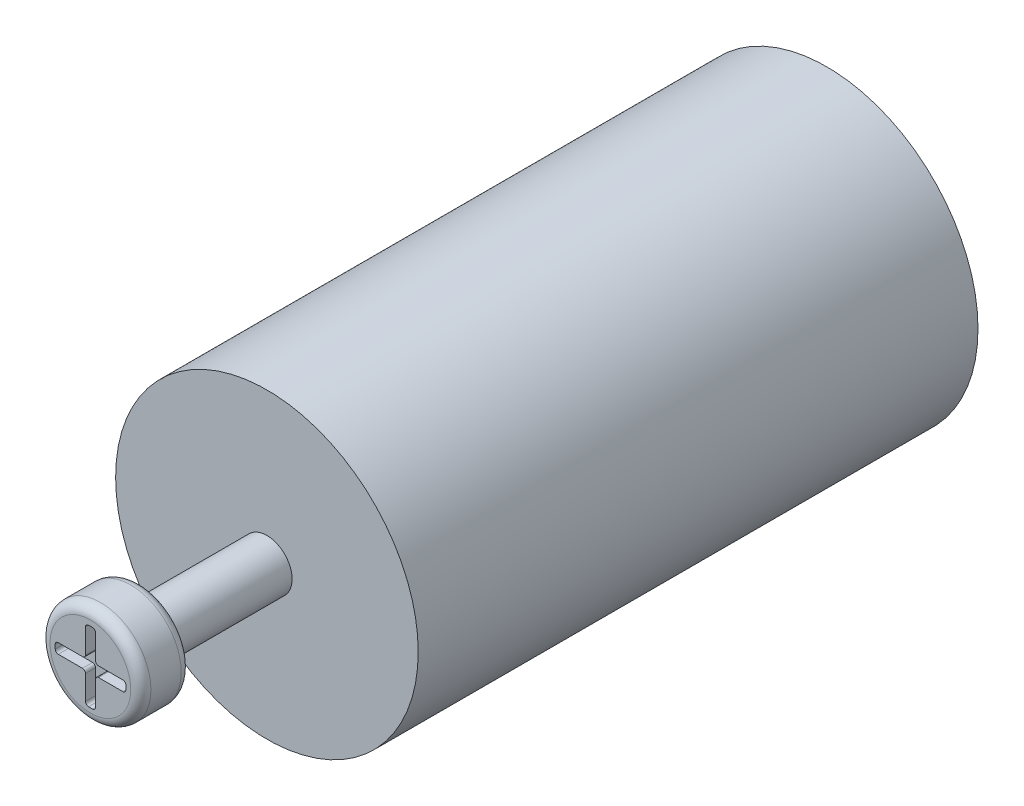
ISO-10303-21;
HEADER;
FILE_DESCRIPTION(('STEP AP214'),'2;1');
FILE_NAME('part.step','',(''),(''),'','','');
FILE_SCHEMA(('AUTOMOTIVE_DESIGN { 1 0 10303 214 1 1 1 1 }'));
ENDSEC;
DATA;
#1=APPLICATION_CONTEXT('core data for automotive mechanical design processes');
#2=APPLICATION_PROTOCOL_DEFINITION('international standard','automotive_design',2000,#1);
#3=PRODUCT_CONTEXT('',#1,'mechanical');
#4=PRODUCT('Part','Part','',(#3));
#5=PRODUCT_RELATED_PRODUCT_CATEGORY('part','',(#4));
#6=PRODUCT_DEFINITION_FORMATION('','',#4);
#7=PRODUCT_DEFINITION_CONTEXT('part definition',#1,'design');
#8=PRODUCT_DEFINITION('design','',#6,#7);
#9=PRODUCT_DEFINITION_SHAPE('','',#8);
#10=(LENGTH_UNIT() NAMED_UNIT(*) SI_UNIT(.MILLI.,.METRE.));
#11=(NAMED_UNIT(*) PLANE_ANGLE_UNIT() SI_UNIT($,.RADIAN.));
#12=(NAMED_UNIT(*) SI_UNIT($,.STERADIAN.) SOLID_ANGLE_UNIT());
#13=UNCERTAINTY_MEASURE_WITH_UNIT(LENGTH_MEASURE(1.E-05),#10,'distance_accuracy_value','');
#14=(GEOMETRIC_REPRESENTATION_CONTEXT(3) GLOBAL_UNCERTAINTY_ASSIGNED_CONTEXT((#13)) GLOBAL_UNIT_ASSIGNED_CONTEXT((#10,
#11,#12)) REPRESENTATION_CONTEXT('',''));
#15=CARTESIAN_POINT('',(0.,0.,0.));
#16=DIRECTION('',(0.,0.,1.));
#17=DIRECTION('',(1.,0.,0.));
#18=AXIS2_PLACEMENT_3D('',#15,#16,#17);
#19=CARTESIAN_POINT('',(0.,0.,6.35));
#20=DIRECTION('',(0.,0.,-1.));
#21=DIRECTION('',(-1.,0.,0.));
#22=AXIS2_PLACEMENT_3D('',#19,#20,#21);
#23=CYLINDRICAL_SURFACE('',#22,6.35);
#24=CARTESIAN_POINT('',(0.,0.,6.35));
#25=DIRECTION('',(0.,0.,1.));
#26=DIRECTION('',(1.,0.,0.));
#27=AXIS2_PLACEMENT_3D('',#24,#25,#26);
#28=CIRCLE('',#27,6.35);
#29=CARTESIAN_POINT('',(6.35,0.,6.35));
#30=VERTEX_POINT('',#29);
#31=EDGE_CURVE('E411',#30,#30,#28,.T.);
#32=ORIENTED_EDGE('',*,*,#31,.F.);
#33=EDGE_LOOP('',(#32));
#34=FACE_BOUND('',#33,.T.);
#35=CARTESIAN_POINT('',(0.,0.,0.));
#36=DIRECTION('',(0.,0.,1.));
#37=DIRECTION('',(1.,0.,0.));
#38=AXIS2_PLACEMENT_3D('',#35,#36,#37);
#39=CIRCLE('',#38,6.35);
#40=CARTESIAN_POINT('',(6.35,0.,0.));
#41=VERTEX_POINT('',#40);
#42=EDGE_CURVE('E416',#41,#41,#39,.T.);
#43=ORIENTED_EDGE('',*,*,#42,.T.);
#44=EDGE_LOOP('',(#43));
#45=FACE_BOUND('',#44,.T.);
#46=ADVANCED_FACE('F47',(#34,#45),#23,.T.);
#47=CARTESIAN_POINT('',(0.,0.,0.));
#48=DIRECTION('',(0.,0.,1.));
#49=DIRECTION('',(1.,0.,0.));
#50=AXIS2_PLACEMENT_3D('',#47,#48,#49);
#51=PLANE('',#50);
#52=ORIENTED_EDGE('',*,*,#42,.F.);
#53=EDGE_LOOP('',(#52));
#54=FACE_BOUND('',#53,.T.);
#55=ADVANCED_FACE('F462',(#54),#51,.F.);
#56=CARTESIAN_POINT('',(0.,0.,147.32));
#57=DIRECTION('',(0.,0.,-1.));
#58=DIRECTION('',(-1.,0.,0.));
#59=AXIS2_PLACEMENT_3D('',#56,#57,#58);
#60=CYLINDRICAL_SURFACE('',#59,38.1);
#61=CARTESIAN_POINT('',(0.,0.,147.32));
#62=DIRECTION('',(0.,0.,1.));
#63=DIRECTION('',(1.,0.,0.));
#64=AXIS2_PLACEMENT_3D('',#61,#62,#63);
#65=CIRCLE('',#64,38.1);
#66=CARTESIAN_POINT('',(38.1,0.,147.32));
#67=VERTEX_POINT('',#66);
#68=EDGE_CURVE('E412',#67,#67,#65,.T.);
#69=ORIENTED_EDGE('',*,*,#68,.F.);
#70=EDGE_LOOP('',(#69));
#71=FACE_BOUND('',#70,.T.);
#72=CARTESIAN_POINT('',(0.,0.,6.35));
#73=DIRECTION('',(0.,0.,1.));
#74=DIRECTION('',(1.,0.,0.));
#75=AXIS2_PLACEMENT_3D('',#72,#73,#74);
#76=CIRCLE('',#75,38.1);
#77=CARTESIAN_POINT('',(38.1,0.,6.35));
#78=VERTEX_POINT('',#77);
#79=EDGE_CURVE('E342',#78,#78,#76,.T.);
#80=ORIENTED_EDGE('',*,*,#79,.T.);
#81=EDGE_LOOP('',(#80));
#82=FACE_BOUND('',#81,.T.);
#83=ADVANCED_FACE('F468',(#71,#82),#60,.T.);
#84=CARTESIAN_POINT('',(0.,0.,147.32));
#85=DIRECTION('',(0.,0.,1.));
#86=DIRECTION('',(1.,0.,0.));
#87=AXIS2_PLACEMENT_3D('',#84,#85,#86);
#88=PLANE('',#87);
#89=CARTESIAN_POINT('',(0.,0.,147.32));
#90=DIRECTION('',(0.,0.,1.));
#91=DIRECTION('',(1.,0.,0.));
#92=AXIS2_PLACEMENT_3D('',#89,#90,#91);
#93=CIRCLE('',#92,6.35);
#94=CARTESIAN_POINT('',(6.35,0.,147.32));
#95=VERTEX_POINT('',#94);
#96=EDGE_CURVE('E406',#95,#95,#93,.T.);
#97=ORIENTED_EDGE('',*,*,#96,.F.);
#98=EDGE_LOOP('',(#97));
#99=FACE_BOUND('',#98,.T.);
#100=ORIENTED_EDGE('',*,*,#68,.T.);
#101=EDGE_LOOP('',(#100));
#102=FACE_BOUND('',#101,.T.);
#103=ADVANCED_FACE('F476',(#99,#102),#88,.T.);
#104=CARTESIAN_POINT('',(0.,0.,6.35));
#105=DIRECTION('',(0.,0.,1.));
#106=DIRECTION('',(1.,0.,0.));
#107=AXIS2_PLACEMENT_3D('',#104,#105,#106);
#108=PLANE('',#107);
#109=ORIENTED_EDGE('',*,*,#31,.T.);
#110=EDGE_LOOP('',(#109));
#111=FACE_BOUND('',#110,.T.);
#112=ORIENTED_EDGE('',*,*,#79,.F.);
#113=EDGE_LOOP('',(#112));
#114=FACE_BOUND('',#113,.T.);
#115=ADVANCED_FACE('F478',(#111,#114),#108,.F.);
#116=CARTESIAN_POINT('',(0.,0.,179.07));
#117=DIRECTION('',(0.,0.,-1.));
#118=DIRECTION('',(-1.,0.,0.));
#119=AXIS2_PLACEMENT_3D('',#116,#117,#118);
#120=CYLINDRICAL_SURFACE('',#119,6.35);
#121=CARTESIAN_POINT('',(0.,0.,176.53));
#122=DIRECTION('',(0.,0.,1.));
#123=DIRECTION('',(1.,0.,0.));
#124=AXIS2_PLACEMENT_3D('',#121,#122,#123);
#125=CIRCLE('',#124,6.35);
#126=CARTESIAN_POINT('',(6.35,0.,176.53));
#127=VERTEX_POINT('',#126);
#128=EDGE_CURVE('E433',#127,#127,#125,.F.);
#129=ORIENTED_EDGE('',*,*,#128,.T.);
#130=EDGE_LOOP('',(#129));
#131=FACE_BOUND('',#130,.T.);
#132=ORIENTED_EDGE('',*,*,#96,.T.);
#133=EDGE_LOOP('',(#132));
#134=FACE_BOUND('',#133,.T.);
#135=ADVANCED_FACE('F481',(#131,#134),#120,.T.);
#136=CARTESIAN_POINT('',(0.,0.,191.77));
#137=DIRECTION('',(0.,0.,-1.));
#138=DIRECTION('',(-1.,0.,0.));
#139=AXIS2_PLACEMENT_3D('',#136,#137,#138);
#140=CYLINDRICAL_SURFACE('',#139,12.7);
#141=CARTESIAN_POINT('',(0.,0.,181.61));
#142=DIRECTION('',(0.,0.,1.));
#143=DIRECTION('',(1.,0.,0.));
#144=AXIS2_PLACEMENT_3D('',#141,#142,#143);
#145=CIRCLE('',#144,12.7);
#146=CARTESIAN_POINT('',(12.7,0.,181.61));
#147=VERTEX_POINT('',#146);
#148=EDGE_CURVE('E56',#147,#147,#145,.T.);
#149=ORIENTED_EDGE('',*,*,#148,.T.);
#150=EDGE_LOOP('',(#149));
#151=FACE_BOUND('',#150,.T.);
#152=CARTESIAN_POINT('',(0.,0.,189.23));
#153=DIRECTION('',(0.,0.,1.));
#154=DIRECTION('',(1.,0.,0.));
#155=AXIS2_PLACEMENT_3D('',#152,#153,#154);
#156=CIRCLE('',#155,12.7);
#157=CARTESIAN_POINT('',(12.7,0.,189.23));
#158=VERTEX_POINT('',#157);
#159=EDGE_CURVE('E437',#158,#158,#156,.F.);
#160=ORIENTED_EDGE('',*,*,#159,.T.);
#161=EDGE_LOOP('',(#160));
#162=FACE_BOUND('',#161,.T.);
#163=ADVANCED_FACE('F444',(#151,#162),#140,.T.);
#164=CARTESIAN_POINT('',(0.,0.,191.77));
#165=DIRECTION('',(0.,0.,1.));
#166=DIRECTION('',(1.,0.,0.));
#167=AXIS2_PLACEMENT_3D('',#164,#165,#166);
#168=PLANE('',#167);
#169=CARTESIAN_POINT('',(-8.0953461848648,-0.621380617762734,191.77));
#170=DIRECTION('',(0.,0.,1.));
#171=DIRECTION('',(1.,0.,0.));
#172=AXIS2_PLACEMENT_3D('',#169,#170,#171);
#173=CIRCLE('',#172,0.762);
#174=CARTESIAN_POINT('',(-8.8573461848648,-0.621380617762734,191.77));
#175=VERTEX_POINT('',#174);
#176=CARTESIAN_POINT('',(-8.0953461848648,-1.38338061776273,191.77));
#177=VERTEX_POINT('',#176);
#178=EDGE_CURVE('E63',#175,#177,#173,.T.);
#179=ORIENTED_EDGE('',*,*,#178,.F.);
#180=DIRECTION('',(0.,-1.,0.));
#181=VECTOR('',#180,1.);
#182=CARTESIAN_POINT('',(-8.8573461848648,0.394619382237266,191.77));
#183=LINE('',#182,#181);
#184=CARTESIAN_POINT('',(-8.8573461848648,0.394619382237266,191.77));
#185=VERTEX_POINT('',#184);
#186=EDGE_CURVE('E336',#185,#175,#183,.T.);
#187=ORIENTED_EDGE('',*,*,#186,.F.);
#188=CARTESIAN_POINT('',(-8.0953461848648,0.394619382237266,191.77));
#189=DIRECTION('',(0.,0.,1.));
#190=DIRECTION('',(-1.,0.,0.));
#191=AXIS2_PLACEMENT_3D('',#188,#189,#190);
#192=CIRCLE('',#191,0.762);
#193=CARTESIAN_POINT('',(-8.0953461848648,1.15661938223727,191.77));
#194=VERTEX_POINT('',#193);
#195=EDGE_CURVE('E333',#194,#185,#192,.T.);
#196=ORIENTED_EDGE('',*,*,#195,.F.);
#197=DIRECTION('',(-1.,0.,0.));
#198=VECTOR('',#197,1.);
#199=CARTESIAN_POINT('',(-8.0953461848648,1.15661938223727,191.77));
#200=LINE('',#199,#198);
#201=CARTESIAN_POINT('',(-1.9993461848648,1.15661938223727,191.77));
#202=VERTEX_POINT('',#201);
#203=EDGE_CURVE('E219',#202,#194,#200,.T.);
#204=ORIENTED_EDGE('',*,*,#203,.F.);
#205=CARTESIAN_POINT('',(-1.9993461848648,1.91861938223727,191.77));
#206=DIRECTION('',(0.,0.,-1.));
#207=DIRECTION('',(-1.,0.,0.));
#208=AXIS2_PLACEMENT_3D('',#205,#206,#207);
#209=CIRCLE('',#208,0.762);
#210=CARTESIAN_POINT('',(-1.2373461848648,1.91861938223727,191.77));
#211=VERTEX_POINT('',#210);
#212=EDGE_CURVE('E327',#211,#202,#209,.T.);
#213=ORIENTED_EDGE('',*,*,#212,.F.);
#214=DIRECTION('',(0.,-1.,0.));
#215=VECTOR('',#214,1.);
#216=CARTESIAN_POINT('',(-1.23734618486481,8.01461938223727,191.77));
#217=LINE('',#216,#215);
#218=CARTESIAN_POINT('',(-1.23734618486481,8.01461938223727,191.77));
#219=VERTEX_POINT('',#218);
#220=EDGE_CURVE('E323',#219,#211,#217,.T.);
#221=ORIENTED_EDGE('',*,*,#220,.F.);
#222=CARTESIAN_POINT('',(-0.475346184864806,8.01461938223727,191.77));
#223=DIRECTION('',(0.,0.,1.));
#224=DIRECTION('',(-1.,0.,0.));
#225=AXIS2_PLACEMENT_3D('',#222,#223,#224);
#226=CIRCLE('',#225,0.761999999999999);
#227=CARTESIAN_POINT('',(-0.475346184864806,8.77661938223727,191.77));
#228=VERTEX_POINT('',#227);
#229=EDGE_CURVE('E319',#228,#219,#226,.T.);
#230=ORIENTED_EDGE('',*,*,#229,.F.);
#231=DIRECTION('',(-1.,0.,0.));
#232=VECTOR('',#231,1.);
#233=CARTESIAN_POINT('',(-0.475346184864806,8.77661938223727,191.77));
#234=LINE('',#233,#232);
#235=CARTESIAN_POINT('',(0.540653815135194,8.77661938223727,191.77));
#236=VERTEX_POINT('',#235);
#237=EDGE_CURVE('E315',#236,#228,#234,.T.);
#238=ORIENTED_EDGE('',*,*,#237,.F.);
#239=CARTESIAN_POINT('',(0.540653815135194,8.01461938223727,191.77));
#240=DIRECTION('',(0.,0.,1.));
#241=DIRECTION('',(1.,0.,0.));
#242=AXIS2_PLACEMENT_3D('',#239,#240,#241);
#243=CIRCLE('',#242,0.761999999999999);
#244=CARTESIAN_POINT('',(1.30265381513519,8.01461938223727,191.77));
#245=VERTEX_POINT('',#244);
#246=EDGE_CURVE('E311',#245,#236,#243,.T.);
#247=ORIENTED_EDGE('',*,*,#246,.F.);
#248=DIRECTION('',(0.,1.,0.));
#249=VECTOR('',#248,1.);
#250=CARTESIAN_POINT('',(1.30265381513519,8.01461938223727,191.77));
#251=LINE('',#250,#249);
#252=CARTESIAN_POINT('',(1.30265381513519,1.91861938223727,191.77));
#253=VERTEX_POINT('',#252);
#254=EDGE_CURVE('E307',#253,#245,#251,.T.);
#255=ORIENTED_EDGE('',*,*,#254,.F.);
#256=CARTESIAN_POINT('',(2.0646538151352,1.91861938223727,191.77));
#257=DIRECTION('',(0.,0.,-1.));
#258=DIRECTION('',(-1.,0.,0.));
#259=AXIS2_PLACEMENT_3D('',#256,#257,#258);
#260=CIRCLE('',#259,0.762);
#261=CARTESIAN_POINT('',(2.0646538151352,1.15661938223727,191.77));
#262=VERTEX_POINT('',#261);
#263=EDGE_CURVE('E303',#262,#253,#260,.T.);
#264=ORIENTED_EDGE('',*,*,#263,.F.);
#265=DIRECTION('',(-1.,0.,0.));
#266=VECTOR('',#265,1.);
#267=CARTESIAN_POINT('',(2.0646538151352,1.15661938223727,191.77));
#268=LINE('',#267,#266);
#269=CARTESIAN_POINT('',(8.16065381513519,1.15661938223727,191.77));
#270=VERTEX_POINT('',#269);
#271=EDGE_CURVE('E299',#270,#262,#268,.T.);
#272=ORIENTED_EDGE('',*,*,#271,.F.);
#273=CARTESIAN_POINT('',(8.16065381513519,0.394619382237266,191.77));
#274=DIRECTION('',(0.,0.,1.));
#275=DIRECTION('',(1.,0.,0.));
#276=AXIS2_PLACEMENT_3D('',#273,#274,#275);
#277=CIRCLE('',#276,0.762000000000001);
#278=CARTESIAN_POINT('',(8.92265381513519,0.394619382237266,191.77));
#279=VERTEX_POINT('',#278);
#280=EDGE_CURVE('E295',#279,#270,#277,.T.);
#281=ORIENTED_EDGE('',*,*,#280,.F.);
#282=DIRECTION('',(0.,1.,0.));
#283=VECTOR('',#282,1.);
#284=CARTESIAN_POINT('',(8.92265381513519,0.394619382237266,191.77));
#285=LINE('',#284,#283);
#286=CARTESIAN_POINT('',(8.92265381513519,-0.621380617762734,191.77));
#287=VERTEX_POINT('',#286);
#288=EDGE_CURVE('E291',#287,#279,#285,.T.);
#289=ORIENTED_EDGE('',*,*,#288,.F.);
#290=CARTESIAN_POINT('',(8.16065381513519,-0.621380617762734,191.77));
#291=DIRECTION('',(0.,0.,1.));
#292=DIRECTION('',(-1.,0.,0.));
#293=AXIS2_PLACEMENT_3D('',#290,#291,#292);
#294=CIRCLE('',#293,0.762);
#295=CARTESIAN_POINT('',(8.16065381513519,-1.38338061776273,191.77));
#296=VERTEX_POINT('',#295);
#297=EDGE_CURVE('E287',#296,#287,#294,.T.);
#298=ORIENTED_EDGE('',*,*,#297,.F.);
#299=DIRECTION('',(1.,0.,0.));
#300=VECTOR('',#299,1.);
#301=CARTESIAN_POINT('',(2.0646538151352,-1.38338061776273,191.77));
#302=LINE('',#301,#300);
#303=CARTESIAN_POINT('',(2.0646538151352,-1.38338061776273,191.77));
#304=VERTEX_POINT('',#303);
#305=EDGE_CURVE('E283',#304,#296,#302,.T.);
#306=ORIENTED_EDGE('',*,*,#305,.F.);
#307=CARTESIAN_POINT('',(2.0646538151352,-2.14538061776273,191.77));
#308=DIRECTION('',(0.,0.,-1.));
#309=DIRECTION('',(-1.,0.,0.));
#310=AXIS2_PLACEMENT_3D('',#307,#308,#309);
#311=CIRCLE('',#310,0.762);
#312=CARTESIAN_POINT('',(1.3026538151352,-2.14538061776273,191.77));
#313=VERTEX_POINT('',#312);
#314=EDGE_CURVE('E279',#313,#304,#311,.T.);
#315=ORIENTED_EDGE('',*,*,#314,.F.);
#316=DIRECTION('',(0.,1.,0.));
#317=VECTOR('',#316,1.);
#318=CARTESIAN_POINT('',(1.3026538151352,-2.14538061776273,191.77));
#319=LINE('',#318,#317);
#320=CARTESIAN_POINT('',(1.3026538151352,-8.24138061776272,191.77));
#321=VERTEX_POINT('',#320);
#322=EDGE_CURVE('E275',#321,#313,#319,.T.);
#323=ORIENTED_EDGE('',*,*,#322,.F.);
#324=CARTESIAN_POINT('',(0.540653815135196,-8.24138061776272,191.77));
#325=DIRECTION('',(0.,0.,1.));
#326=DIRECTION('',(1.,0.,0.));
#327=AXIS2_PLACEMENT_3D('',#324,#325,#326);
#328=CIRCLE('',#327,0.762000000000001);
#329=CARTESIAN_POINT('',(0.540653815135196,-9.00338061776272,191.77));
#330=VERTEX_POINT('',#329);
#331=EDGE_CURVE('E271',#330,#321,#328,.T.);
#332=ORIENTED_EDGE('',*,*,#331,.F.);
#333=DIRECTION('',(1.,0.,0.));
#334=VECTOR('',#333,1.);
#335=CARTESIAN_POINT('',(-0.475346184864804,-9.00338061776272,191.77));
#336=LINE('',#335,#334);
#337=CARTESIAN_POINT('',(-0.475346184864804,-9.00338061776272,191.77));
#338=VERTEX_POINT('',#337);
#339=EDGE_CURVE('E267',#338,#330,#336,.T.);
#340=ORIENTED_EDGE('',*,*,#339,.F.);
#341=CARTESIAN_POINT('',(-0.475346184864804,-8.24138061776272,191.77));
#342=DIRECTION('',(0.,0.,1.));
#343=DIRECTION('',(-1.,0.,0.));
#344=AXIS2_PLACEMENT_3D('',#341,#342,#343);
#345=CIRCLE('',#344,0.762000000000001);
#346=CARTESIAN_POINT('',(-1.2373461848648,-8.24138061776272,191.77));
#347=VERTEX_POINT('',#346);
#348=EDGE_CURVE('E263',#347,#338,#345,.T.);
#349=ORIENTED_EDGE('',*,*,#348,.F.);
#350=DIRECTION('',(0.,-1.,0.));
#351=VECTOR('',#350,1.);
#352=CARTESIAN_POINT('',(-1.2373461848648,-2.14538061776273,191.77));
#353=LINE('',#352,#351);
#354=CARTESIAN_POINT('',(-1.2373461848648,-2.14538061776273,191.77));
#355=VERTEX_POINT('',#354);
#356=EDGE_CURVE('E259',#355,#347,#353,.T.);
#357=ORIENTED_EDGE('',*,*,#356,.F.);
#358=CARTESIAN_POINT('',(-1.9993461848648,-2.14538061776273,191.77));
#359=DIRECTION('',(0.,0.,-1.));
#360=DIRECTION('',(1.,0.,0.));
#361=AXIS2_PLACEMENT_3D('',#358,#359,#360);
#362=CIRCLE('',#361,0.762);
#363=CARTESIAN_POINT('',(-1.9993461848648,-1.38338061776273,191.77));
#364=VERTEX_POINT('',#363);
#365=EDGE_CURVE('E255',#364,#355,#362,.T.);
#366=ORIENTED_EDGE('',*,*,#365,.F.);
#367=DIRECTION('',(1.,0.,0.));
#368=VECTOR('',#367,1.);
#369=CARTESIAN_POINT('',(-8.0953461848648,-1.38338061776273,191.77));
#370=LINE('',#369,#368);
#371=EDGE_CURVE('E251',#177,#364,#370,.T.);
#372=ORIENTED_EDGE('',*,*,#371,.F.);
#373=EDGE_LOOP('',(#179,#187,#196,#204,#213,#221,#230,#238,#247,#255,#264,#272,#281,#289,#298,
#306,#315,#323,#332,#340,#349,#357,#366,#372));
#374=FACE_BOUND('',#373,.T.);
#375=CARTESIAN_POINT('',(0.,0.,191.77));
#376=DIRECTION('',(0.,0.,1.));
#377=DIRECTION('',(1.,0.,0.));
#378=AXIS2_PLACEMENT_3D('',#375,#376,#377);
#379=CIRCLE('',#378,10.16);
#380=CARTESIAN_POINT('',(10.16,0.,191.77));
#381=VERTEX_POINT('',#380);
#382=EDGE_CURVE('E11',#381,#381,#379,.T.);
#383=ORIENTED_EDGE('',*,*,#382,.T.);
#384=EDGE_LOOP('',(#383));
#385=FACE_BOUND('',#384,.T.);
#386=ADVANCED_FACE('F491',(#374,#385),#168,.T.);
#387=CARTESIAN_POINT('',(0.,0.,179.07));
#388=DIRECTION('',(0.,0.,1.));
#389=DIRECTION('',(1.,0.,0.));
#390=AXIS2_PLACEMENT_3D('',#387,#388,#389);
#391=PLANE('',#390);
#392=CARTESIAN_POINT('',(0.,0.,179.07));
#393=DIRECTION('',(0.,0.,1.));
#394=DIRECTION('',(1.,0.,0.));
#395=AXIS2_PLACEMENT_3D('',#392,#393,#394);
#396=CIRCLE('',#395,8.89);
#397=CARTESIAN_POINT('',(8.89,0.,179.07));
#398=VERTEX_POINT('',#397);
#399=EDGE_CURVE('E429',#398,#398,#396,.T.);
#400=ORIENTED_EDGE('',*,*,#399,.T.);
#401=EDGE_LOOP('',(#400));
#402=FACE_BOUND('',#401,.T.);
#403=CARTESIAN_POINT('',(0.,0.,179.07));
#404=DIRECTION('',(0.,0.,1.));
#405=DIRECTION('',(1.,0.,0.));
#406=AXIS2_PLACEMENT_3D('',#403,#404,#405);
#407=CIRCLE('',#406,10.16);
#408=CARTESIAN_POINT('',(10.16,0.,179.07));
#409=VERTEX_POINT('',#408);
#410=EDGE_CURVE('E410',#409,#409,#407,.F.);
#411=ORIENTED_EDGE('',*,*,#410,.T.);
#412=EDGE_LOOP('',(#411));
#413=FACE_BOUND('',#412,.T.);
#414=ADVANCED_FACE('F457',(#402,#413),#391,.F.);
#415=CARTESIAN_POINT('',(0.,0.,176.53));
#416=DIRECTION('',(0.,0.,1.));
#417=DIRECTION('',(1.,0.,0.));
#418=AXIS2_PLACEMENT_3D('',#415,#416,#417);
#419=TOROIDAL_SURFACE('',#418,8.89,2.54);
#420=ORIENTED_EDGE('',*,*,#128,.F.);
#421=EDGE_LOOP('',(#420));
#422=FACE_BOUND('',#421,.T.);
#423=ORIENTED_EDGE('',*,*,#399,.F.);
#424=EDGE_LOOP('',(#423));
#425=FACE_BOUND('',#424,.T.);
#426=ADVANCED_FACE('F449',(#422,#425),#419,.F.);
#427=CARTESIAN_POINT('',(0.,0.,181.61));
#428=DIRECTION('',(0.,0.,1.));
#429=DIRECTION('',(1.,0.,0.));
#430=AXIS2_PLACEMENT_3D('',#427,#428,#429);
#431=TOROIDAL_SURFACE('',#430,10.16,2.54);
#432=ORIENTED_EDGE('',*,*,#410,.F.);
#433=EDGE_LOOP('',(#432));
#434=FACE_BOUND('',#433,.T.);
#435=ORIENTED_EDGE('',*,*,#148,.F.);
#436=EDGE_LOOP('',(#435));
#437=FACE_BOUND('',#436,.T.);
#438=ADVANCED_FACE('F447',(#434,#437),#431,.T.);
#439=CARTESIAN_POINT('',(0.,0.,189.23));
#440=DIRECTION('',(0.,0.,1.));
#441=DIRECTION('',(1.,0.,0.));
#442=AXIS2_PLACEMENT_3D('',#439,#440,#441);
#443=TOROIDAL_SURFACE('',#442,10.16,2.54);
#444=ORIENTED_EDGE('',*,*,#159,.F.);
#445=EDGE_LOOP('',(#444));
#446=FACE_BOUND('',#445,.T.);
#447=ORIENTED_EDGE('',*,*,#382,.F.);
#448=EDGE_LOOP('',(#447));
#449=FACE_BOUND('',#448,.T.);
#450=ADVANCED_FACE('F49',(#446,#449),#443,.T.);
#451=CARTESIAN_POINT('',(-8.0953461848648,-0.621380617762734,189.23));
#452=DIRECTION('',(0.,0.,1.));
#453=DIRECTION('',(1.,0.,0.));
#454=AXIS2_PLACEMENT_3D('',#451,#452,#453);
#455=CYLINDRICAL_SURFACE('',#454,0.762);
#456=ORIENTED_EDGE('',*,*,#178,.T.);
#457=DIRECTION('',(0.,0.,1.));
#458=VECTOR('',#457,1.);
#459=CARTESIAN_POINT('',(-8.0953461848648,-1.38338061776273,189.23));
#460=LINE('',#459,#458);
#461=CARTESIAN_POINT('',(-8.0953461848648,-1.38338061776273,189.23));
#462=VERTEX_POINT('',#461);
#463=EDGE_CURVE('E147',#462,#177,#460,.T.);
#464=ORIENTED_EDGE('',*,*,#463,.F.);
#465=CARTESIAN_POINT('',(-8.0953461848648,-0.621380617762734,189.23));
#466=DIRECTION('',(0.,0.,1.));
#467=DIRECTION('',(1.,0.,0.));
#468=AXIS2_PLACEMENT_3D('',#465,#466,#467);
#469=CIRCLE('',#468,0.762);
#470=CARTESIAN_POINT('',(-8.8573461848648,-0.621380617762734,189.23));
#471=VERTEX_POINT('',#470);
#472=EDGE_CURVE('E339',#471,#462,#469,.T.);
#473=ORIENTED_EDGE('',*,*,#472,.F.);
#474=DIRECTION('',(0.,0.,1.));
#475=VECTOR('',#474,1.);
#476=CARTESIAN_POINT('',(-8.8573461848648,-0.621380617762734,189.23));
#477=LINE('',#476,#475);
#478=EDGE_CURVE('E71',#471,#175,#477,.T.);
#479=ORIENTED_EDGE('',*,*,#478,.T.);
#480=EDGE_LOOP('',(#456,#464,#473,#479));
#481=FACE_BOUND('',#480,.T.);
#482=ADVANCED_FACE('F455',(#481),#455,.F.);
#483=CARTESIAN_POINT('',(-8.8573461848648,0.394619382237266,189.23));
#484=DIRECTION('',(-1.,0.,0.));
#485=DIRECTION('',(0.,0.,1.));
#486=AXIS2_PLACEMENT_3D('',#483,#484,#485);
#487=PLANE('',#486);
#488=ORIENTED_EDGE('',*,*,#186,.T.);
#489=ORIENTED_EDGE('',*,*,#478,.F.);
#490=DIRECTION('',(0.,-1.,0.));
#491=VECTOR('',#490,1.);
#492=CARTESIAN_POINT('',(-8.8573461848648,0.394619382237266,189.23));
#493=LINE('',#492,#491);
#494=CARTESIAN_POINT('',(-8.8573461848648,0.394619382237266,189.23));
#495=VERTEX_POINT('',#494);
#496=EDGE_CURVE('E233',#495,#471,#493,.T.);
#497=ORIENTED_EDGE('',*,*,#496,.F.);
#498=DIRECTION('',(0.,0.,1.));
#499=VECTOR('',#498,1.);
#500=CARTESIAN_POINT('',(-8.8573461848648,0.394619382237266,189.23));
#501=LINE('',#500,#499);
#502=EDGE_CURVE('E224',#495,#185,#501,.T.);
#503=ORIENTED_EDGE('',*,*,#502,.T.);
#504=EDGE_LOOP('',(#488,#489,#497,#503));
#505=FACE_BOUND('',#504,.T.);
#506=ADVANCED_FACE('F500',(#505),#487,.F.);
#507=CARTESIAN_POINT('',(-8.0953461848648,0.394619382237266,189.23));
#508=DIRECTION('',(0.,0.,1.));
#509=DIRECTION('',(1.,0.,0.));
#510=AXIS2_PLACEMENT_3D('',#507,#508,#509);
#511=CYLINDRICAL_SURFACE('',#510,0.762);
#512=ORIENTED_EDGE('',*,*,#195,.T.);
#513=ORIENTED_EDGE('',*,*,#502,.F.);
#514=CARTESIAN_POINT('',(-8.0953461848648,0.394619382237266,189.23));
#515=DIRECTION('',(0.,0.,1.));
#516=DIRECTION('',(-1.,0.,0.));
#517=AXIS2_PLACEMENT_3D('',#514,#515,#516);
#518=CIRCLE('',#517,0.762);
#519=CARTESIAN_POINT('',(-8.0953461848648,1.15661938223727,189.23));
#520=VERTEX_POINT('',#519);
#521=EDGE_CURVE('E228',#520,#495,#518,.T.);
#522=ORIENTED_EDGE('',*,*,#521,.F.);
#523=DIRECTION('',(0.,0.,1.));
#524=VECTOR('',#523,1.);
#525=CARTESIAN_POINT('',(-8.0953461848648,1.15661938223727,189.23));
#526=LINE('',#525,#524);
#527=EDGE_CURVE('E212',#520,#194,#526,.T.);
#528=ORIENTED_EDGE('',*,*,#527,.T.);
#529=EDGE_LOOP('',(#512,#513,#522,#528));
#530=FACE_BOUND('',#529,.T.);
#531=ADVANCED_FACE('F229',(#530),#511,.F.);
#532=CARTESIAN_POINT('',(-8.0953461848648,1.15661938223727,189.23));
#533=DIRECTION('',(0.,1.,0.));
#534=DIRECTION('',(0.,0.,1.));
#535=AXIS2_PLACEMENT_3D('',#532,#533,#534);
#536=PLANE('',#535);
#537=ORIENTED_EDGE('',*,*,#203,.T.);
#538=ORIENTED_EDGE('',*,*,#527,.F.);
#539=DIRECTION('',(-1.,0.,0.));
#540=VECTOR('',#539,1.);
#541=CARTESIAN_POINT('',(-8.0953461848648,1.15661938223727,189.23));
#542=LINE('',#541,#540);
#543=CARTESIAN_POINT('',(-1.9993461848648,1.15661938223727,189.23));
#544=VERTEX_POINT('',#543);
#545=EDGE_CURVE('E216',#544,#520,#542,.T.);
#546=ORIENTED_EDGE('',*,*,#545,.F.);
#547=DIRECTION('',(0.,0.,1.));
#548=VECTOR('',#547,1.);
#549=CARTESIAN_POINT('',(-1.9993461848648,1.15661938223727,189.23));
#550=LINE('',#549,#548);
#551=EDGE_CURVE('E225',#544,#202,#550,.T.);
#552=ORIENTED_EDGE('',*,*,#551,.T.);
#553=EDGE_LOOP('',(#537,#538,#546,#552));
#554=FACE_BOUND('',#553,.T.);
#555=ADVANCED_FACE('F214',(#554),#536,.F.);
#556=CARTESIAN_POINT('',(-1.9993461848648,1.91861938223727,189.23));
#557=DIRECTION('',(0.,0.,1.));
#558=DIRECTION('',(1.,0.,0.));
#559=AXIS2_PLACEMENT_3D('',#556,#557,#558);
#560=CYLINDRICAL_SURFACE('',#559,0.762);
#561=ORIENTED_EDGE('',*,*,#212,.T.);
#562=ORIENTED_EDGE('',*,*,#551,.F.);
#563=CARTESIAN_POINT('',(-1.9993461848648,1.91861938223727,189.23));
#564=DIRECTION('',(0.,0.,-1.));
#565=DIRECTION('',(-1.,0.,0.));
#566=AXIS2_PLACEMENT_3D('',#563,#564,#565);
#567=CIRCLE('',#566,0.762);
#568=CARTESIAN_POINT('',(-1.2373461848648,1.91861938223727,189.23));
#569=VERTEX_POINT('',#568);
#570=EDGE_CURVE('E239',#569,#544,#567,.T.);
#571=ORIENTED_EDGE('',*,*,#570,.F.);
#572=DIRECTION('',(0.,0.,1.));
#573=VECTOR('',#572,1.);
#574=CARTESIAN_POINT('',(-1.2373461848648,1.91861938223727,189.23));
#575=LINE('',#574,#573);
#576=EDGE_CURVE('E347',#569,#211,#575,.T.);
#577=ORIENTED_EDGE('',*,*,#576,.T.);
#578=EDGE_LOOP('',(#561,#562,#571,#577));
#579=FACE_BOUND('',#578,.T.);
#580=ADVANCED_FACE('F576',(#579),#560,.T.);
#581=CARTESIAN_POINT('',(-1.23734618486481,8.01461938223727,189.23));
#582=DIRECTION('',(-1.,0.,0.));
#583=DIRECTION('',(0.,-1.,0.));
#584=AXIS2_PLACEMENT_3D('',#581,#582,#583);
#585=PLANE('',#584);
#586=ORIENTED_EDGE('',*,*,#220,.T.);
#587=ORIENTED_EDGE('',*,*,#576,.F.);
#588=DIRECTION('',(0.,-1.,0.));
#589=VECTOR('',#588,1.);
#590=CARTESIAN_POINT('',(-1.23734618486481,8.01461938223727,189.23));
#591=LINE('',#590,#589);
#592=CARTESIAN_POINT('',(-1.23734618486481,8.01461938223727,189.23));
#593=VERTEX_POINT('',#592);
#594=EDGE_CURVE('E243',#593,#569,#591,.T.);
#595=ORIENTED_EDGE('',*,*,#594,.F.);
#596=DIRECTION('',(0.,0.,1.));
#597=VECTOR('',#596,1.);
#598=CARTESIAN_POINT('',(-1.23734618486481,8.01461938223727,189.23));
#599=LINE('',#598,#597);
#600=EDGE_CURVE('E350',#593,#219,#599,.T.);
#601=ORIENTED_EDGE('',*,*,#600,.T.);
#602=EDGE_LOOP('',(#586,#587,#595,#601));
#603=FACE_BOUND('',#602,.T.);
#604=ADVANCED_FACE('F572',(#603),#585,.F.);
#605=CARTESIAN_POINT('',(-0.475346184864806,8.01461938223727,189.23));
#606=DIRECTION('',(0.,0.,1.));
#607=DIRECTION('',(1.,0.,0.));
#608=AXIS2_PLACEMENT_3D('',#605,#606,#607);
#609=CYLINDRICAL_SURFACE('',#608,0.761999999999999);
#610=ORIENTED_EDGE('',*,*,#229,.T.);
#611=ORIENTED_EDGE('',*,*,#600,.F.);
#612=CARTESIAN_POINT('',(-0.475346184864806,8.01461938223727,189.23));
#613=DIRECTION('',(0.,0.,1.));
#614=DIRECTION('',(-1.,0.,0.));
#615=AXIS2_PLACEMENT_3D('',#612,#613,#614);
#616=CIRCLE('',#615,0.761999999999999);
#617=CARTESIAN_POINT('',(-0.475346184864806,8.77661938223727,189.23));
#618=VERTEX_POINT('',#617);
#619=EDGE_CURVE('E883',#618,#593,#616,.T.);
#620=ORIENTED_EDGE('',*,*,#619,.F.);
#621=DIRECTION('',(0.,0.,1.));
#622=VECTOR('',#621,1.);
#623=CARTESIAN_POINT('',(-0.475346184864806,8.77661938223727,189.23));
#624=LINE('',#623,#622);
#625=EDGE_CURVE('E353',#618,#228,#624,.T.);
#626=ORIENTED_EDGE('',*,*,#625,.T.);
#627=EDGE_LOOP('',(#610,#611,#620,#626));
#628=FACE_BOUND('',#627,.T.);
#629=ADVANCED_FACE('F568',(#628),#609,.F.);
#630=CARTESIAN_POINT('',(-0.475346184864806,8.77661938223727,189.23));
#631=DIRECTION('',(0.,1.,0.));
#632=DIRECTION('',(0.,0.,1.));
#633=AXIS2_PLACEMENT_3D('',#630,#631,#632);
#634=PLANE('',#633);
#635=ORIENTED_EDGE('',*,*,#237,.T.);
#636=ORIENTED_EDGE('',*,*,#625,.F.);
#637=DIRECTION('',(-1.,0.,0.));
#638=VECTOR('',#637,1.);
#639=CARTESIAN_POINT('',(-0.475346184864806,8.77661938223727,189.23));
#640=LINE('',#639,#638);
#641=CARTESIAN_POINT('',(0.540653815135194,8.77661938223727,189.23));
#642=VERTEX_POINT('',#641);
#643=EDGE_CURVE('E879',#642,#618,#640,.T.);
#644=ORIENTED_EDGE('',*,*,#643,.F.);
#645=DIRECTION('',(0.,0.,1.));
#646=VECTOR('',#645,1.);
#647=CARTESIAN_POINT('',(0.540653815135194,8.77661938223727,189.23));
#648=LINE('',#647,#646);
#649=EDGE_CURVE('E356',#642,#236,#648,.T.);
#650=ORIENTED_EDGE('',*,*,#649,.T.);
#651=EDGE_LOOP('',(#635,#636,#644,#650));
#652=FACE_BOUND('',#651,.T.);
#653=ADVANCED_FACE('F564',(#652),#634,.F.);
#654=CARTESIAN_POINT('',(0.540653815135194,8.01461938223727,189.23));
#655=DIRECTION('',(0.,0.,1.));
#656=DIRECTION('',(1.,0.,0.));
#657=AXIS2_PLACEMENT_3D('',#654,#655,#656);
#658=CYLINDRICAL_SURFACE('',#657,0.761999999999999);
#659=ORIENTED_EDGE('',*,*,#246,.T.);
#660=ORIENTED_EDGE('',*,*,#649,.F.);
#661=CARTESIAN_POINT('',(0.540653815135194,8.01461938223727,189.23));
#662=DIRECTION('',(0.,0.,1.));
#663=DIRECTION('',(1.,0.,0.));
#664=AXIS2_PLACEMENT_3D('',#661,#662,#663);
#665=CIRCLE('',#664,0.761999999999999);
#666=CARTESIAN_POINT('',(1.30265381513519,8.01461938223727,189.23));
#667=VERTEX_POINT('',#666);
#668=EDGE_CURVE('E875',#667,#642,#665,.T.);
#669=ORIENTED_EDGE('',*,*,#668,.F.);
#670=DIRECTION('',(0.,0.,1.));
#671=VECTOR('',#670,1.);
#672=CARTESIAN_POINT('',(1.30265381513519,8.01461938223727,189.23));
#673=LINE('',#672,#671);
#674=EDGE_CURVE('E359',#667,#245,#673,.T.);
#675=ORIENTED_EDGE('',*,*,#674,.T.);
#676=EDGE_LOOP('',(#659,#660,#669,#675));
#677=FACE_BOUND('',#676,.T.);
#678=ADVANCED_FACE('F560',(#677),#658,.F.);
#679=CARTESIAN_POINT('',(1.30265381513519,8.01461938223727,189.23));
#680=DIRECTION('',(1.,0.,0.));
#681=DIRECTION('',(0.,1.,0.));
#682=AXIS2_PLACEMENT_3D('',#679,#680,#681);
#683=PLANE('',#682);
#684=ORIENTED_EDGE('',*,*,#254,.T.);
#685=ORIENTED_EDGE('',*,*,#674,.F.);
#686=DIRECTION('',(0.,1.,0.));
#687=VECTOR('',#686,1.);
#688=CARTESIAN_POINT('',(1.30265381513519,8.01461938223727,189.23));
#689=LINE('',#688,#687);
#690=CARTESIAN_POINT('',(1.30265381513519,1.91861938223727,189.23));
#691=VERTEX_POINT('',#690);
#692=EDGE_CURVE('E871',#691,#667,#689,.T.);
#693=ORIENTED_EDGE('',*,*,#692,.F.);
#694=DIRECTION('',(0.,0.,1.));
#695=VECTOR('',#694,1.);
#696=CARTESIAN_POINT('',(1.30265381513519,1.91861938223727,189.23));
#697=LINE('',#696,#695);
#698=EDGE_CURVE('E362',#691,#253,#697,.T.);
#699=ORIENTED_EDGE('',*,*,#698,.T.);
#700=EDGE_LOOP('',(#684,#685,#693,#699));
#701=FACE_BOUND('',#700,.T.);
#702=ADVANCED_FACE('F556',(#701),#683,.F.);
#703=CARTESIAN_POINT('',(2.0646538151352,1.91861938223727,189.23));
#704=DIRECTION('',(0.,0.,1.));
#705=DIRECTION('',(1.,0.,0.));
#706=AXIS2_PLACEMENT_3D('',#703,#704,#705);
#707=CYLINDRICAL_SURFACE('',#706,0.762);
#708=ORIENTED_EDGE('',*,*,#263,.T.);
#709=ORIENTED_EDGE('',*,*,#698,.F.);
#710=CARTESIAN_POINT('',(2.0646538151352,1.91861938223727,189.23));
#711=DIRECTION('',(0.,0.,-1.));
#712=DIRECTION('',(-1.,0.,0.));
#713=AXIS2_PLACEMENT_3D('',#710,#711,#712);
#714=CIRCLE('',#713,0.762);
#715=CARTESIAN_POINT('',(2.0646538151352,1.15661938223727,189.23));
#716=VERTEX_POINT('',#715);
#717=EDGE_CURVE('E867',#716,#691,#714,.T.);
#718=ORIENTED_EDGE('',*,*,#717,.F.);
#719=DIRECTION('',(0.,0.,1.));
#720=VECTOR('',#719,1.);
#721=CARTESIAN_POINT('',(2.0646538151352,1.15661938223727,189.23));
#722=LINE('',#721,#720);
#723=EDGE_CURVE('E365',#716,#262,#722,.T.);
#724=ORIENTED_EDGE('',*,*,#723,.T.);
#725=EDGE_LOOP('',(#708,#709,#718,#724));
#726=FACE_BOUND('',#725,.T.);
#727=ADVANCED_FACE('F552',(#726),#707,.T.);
#728=CARTESIAN_POINT('',(2.0646538151352,1.15661938223727,189.23));
#729=DIRECTION('',(0.,1.,0.));
#730=DIRECTION('',(0.,0.,1.));
#731=AXIS2_PLACEMENT_3D('',#728,#729,#730);
#732=PLANE('',#731);
#733=ORIENTED_EDGE('',*,*,#271,.T.);
#734=ORIENTED_EDGE('',*,*,#723,.F.);
#735=DIRECTION('',(-1.,0.,0.));
#736=VECTOR('',#735,1.);
#737=CARTESIAN_POINT('',(2.0646538151352,1.15661938223727,189.23));
#738=LINE('',#737,#736);
#739=CARTESIAN_POINT('',(8.16065381513519,1.15661938223727,189.23));
#740=VERTEX_POINT('',#739);
#741=EDGE_CURVE('E863',#740,#716,#738,.T.);
#742=ORIENTED_EDGE('',*,*,#741,.F.);
#743=DIRECTION('',(0.,0.,1.));
#744=VECTOR('',#743,1.);
#745=CARTESIAN_POINT('',(8.16065381513519,1.15661938223727,189.23));
#746=LINE('',#745,#744);
#747=EDGE_CURVE('E368',#740,#270,#746,.T.);
#748=ORIENTED_EDGE('',*,*,#747,.T.);
#749=EDGE_LOOP('',(#733,#734,#742,#748));
#750=FACE_BOUND('',#749,.T.);
#751=ADVANCED_FACE('F548',(#750),#732,.F.);
#752=CARTESIAN_POINT('',(8.16065381513519,0.394619382237266,189.23));
#753=DIRECTION('',(0.,0.,1.));
#754=DIRECTION('',(1.,0.,0.));
#755=AXIS2_PLACEMENT_3D('',#752,#753,#754);
#756=CYLINDRICAL_SURFACE('',#755,0.762000000000001);
#757=ORIENTED_EDGE('',*,*,#280,.T.);
#758=ORIENTED_EDGE('',*,*,#747,.F.);
#759=CARTESIAN_POINT('',(8.16065381513519,0.394619382237266,189.23));
#760=DIRECTION('',(0.,0.,1.));
#761=DIRECTION('',(1.,0.,0.));
#762=AXIS2_PLACEMENT_3D('',#759,#760,#761);
#763=CIRCLE('',#762,0.762000000000001);
#764=CARTESIAN_POINT('',(8.92265381513519,0.394619382237266,189.23));
#765=VERTEX_POINT('',#764);
#766=EDGE_CURVE('E859',#765,#740,#763,.T.);
#767=ORIENTED_EDGE('',*,*,#766,.F.);
#768=DIRECTION('',(0.,0.,1.));
#769=VECTOR('',#768,1.);
#770=CARTESIAN_POINT('',(8.92265381513519,0.394619382237266,189.23));
#771=LINE('',#770,#769);
#772=EDGE_CURVE('E371',#765,#279,#771,.T.);
#773=ORIENTED_EDGE('',*,*,#772,.T.);
#774=EDGE_LOOP('',(#757,#758,#767,#773));
#775=FACE_BOUND('',#774,.T.);
#776=ADVANCED_FACE('F544',(#775),#756,.F.);
#777=CARTESIAN_POINT('',(8.92265381513519,0.394619382237266,189.23));
#778=DIRECTION('',(1.,0.,0.));
#779=DIRECTION('',(0.,0.,-1.));
#780=AXIS2_PLACEMENT_3D('',#777,#778,#779);
#781=PLANE('',#780);
#782=ORIENTED_EDGE('',*,*,#288,.T.);
#783=ORIENTED_EDGE('',*,*,#772,.F.);
#784=DIRECTION('',(0.,1.,0.));
#785=VECTOR('',#784,1.);
#786=CARTESIAN_POINT('',(8.92265381513519,0.394619382237266,189.23));
#787=LINE('',#786,#785);
#788=CARTESIAN_POINT('',(8.92265381513519,-0.621380617762734,189.23));
#789=VERTEX_POINT('',#788);
#790=EDGE_CURVE('E855',#789,#765,#787,.T.);
#791=ORIENTED_EDGE('',*,*,#790,.F.);
#792=DIRECTION('',(0.,0.,1.));
#793=VECTOR('',#792,1.);
#794=CARTESIAN_POINT('',(8.92265381513519,-0.621380617762734,189.23));
#795=LINE('',#794,#793);
#796=EDGE_CURVE('E374',#789,#287,#795,.T.);
#797=ORIENTED_EDGE('',*,*,#796,.T.);
#798=EDGE_LOOP('',(#782,#783,#791,#797));
#799=FACE_BOUND('',#798,.T.);
#800=ADVANCED_FACE('F540',(#799),#781,.F.);
#801=CARTESIAN_POINT('',(8.16065381513519,-0.621380617762734,189.23));
#802=DIRECTION('',(0.,0.,1.));
#803=DIRECTION('',(1.,0.,0.));
#804=AXIS2_PLACEMENT_3D('',#801,#802,#803);
#805=CYLINDRICAL_SURFACE('',#804,0.762);
#806=ORIENTED_EDGE('',*,*,#297,.T.);
#807=ORIENTED_EDGE('',*,*,#796,.F.);
#808=CARTESIAN_POINT('',(8.16065381513519,-0.621380617762734,189.23));
#809=DIRECTION('',(0.,0.,1.));
#810=DIRECTION('',(-1.,0.,0.));
#811=AXIS2_PLACEMENT_3D('',#808,#809,#810);
#812=CIRCLE('',#811,0.762);
#813=CARTESIAN_POINT('',(8.16065381513519,-1.38338061776273,189.23));
#814=VERTEX_POINT('',#813);
#815=EDGE_CURVE('E851',#814,#789,#812,.T.);
#816=ORIENTED_EDGE('',*,*,#815,.F.);
#817=DIRECTION('',(0.,0.,1.));
#818=VECTOR('',#817,1.);
#819=CARTESIAN_POINT('',(8.16065381513519,-1.38338061776273,189.23));
#820=LINE('',#819,#818);
#821=EDGE_CURVE('E377',#814,#296,#820,.T.);
#822=ORIENTED_EDGE('',*,*,#821,.T.);
#823=EDGE_LOOP('',(#806,#807,#816,#822));
#824=FACE_BOUND('',#823,.T.);
#825=ADVANCED_FACE('F536',(#824),#805,.F.);
#826=CARTESIAN_POINT('',(2.0646538151352,-1.38338061776273,189.23));
#827=DIRECTION('',(0.,-1.,0.));
#828=DIRECTION('',(0.,0.,-1.));
#829=AXIS2_PLACEMENT_3D('',#826,#827,#828);
#830=PLANE('',#829);
#831=ORIENTED_EDGE('',*,*,#305,.T.);
#832=ORIENTED_EDGE('',*,*,#821,.F.);
#833=DIRECTION('',(1.,0.,0.));
#834=VECTOR('',#833,1.);
#835=CARTESIAN_POINT('',(2.0646538151352,-1.38338061776273,189.23));
#836=LINE('',#835,#834);
#837=CARTESIAN_POINT('',(2.0646538151352,-1.38338061776273,189.23));
#838=VERTEX_POINT('',#837);
#839=EDGE_CURVE('E847',#838,#814,#836,.T.);
#840=ORIENTED_EDGE('',*,*,#839,.F.);
#841=DIRECTION('',(0.,0.,1.));
#842=VECTOR('',#841,1.);
#843=CARTESIAN_POINT('',(2.0646538151352,-1.38338061776273,189.23));
#844=LINE('',#843,#842);
#845=EDGE_CURVE('E380',#838,#304,#844,.T.);
#846=ORIENTED_EDGE('',*,*,#845,.T.);
#847=EDGE_LOOP('',(#831,#832,#840,#846));
#848=FACE_BOUND('',#847,.T.);
#849=ADVANCED_FACE('F532',(#848),#830,.F.);
#850=CARTESIAN_POINT('',(2.0646538151352,-2.14538061776273,189.23));
#851=DIRECTION('',(0.,0.,1.));
#852=DIRECTION('',(1.,0.,0.));
#853=AXIS2_PLACEMENT_3D('',#850,#851,#852);
#854=CYLINDRICAL_SURFACE('',#853,0.762);
#855=ORIENTED_EDGE('',*,*,#314,.T.);
#856=ORIENTED_EDGE('',*,*,#845,.F.);
#857=CARTESIAN_POINT('',(2.0646538151352,-2.14538061776273,189.23));
#858=DIRECTION('',(0.,0.,-1.));
#859=DIRECTION('',(-1.,0.,0.));
#860=AXIS2_PLACEMENT_3D('',#857,#858,#859);
#861=CIRCLE('',#860,0.762);
#862=CARTESIAN_POINT('',(1.3026538151352,-2.14538061776273,189.23));
#863=VERTEX_POINT('',#862);
#864=EDGE_CURVE('E843',#863,#838,#861,.T.);
#865=ORIENTED_EDGE('',*,*,#864,.F.);
#866=DIRECTION('',(0.,0.,1.));
#867=VECTOR('',#866,1.);
#868=CARTESIAN_POINT('',(1.3026538151352,-2.14538061776273,189.23));
#869=LINE('',#868,#867);
#870=EDGE_CURVE('E383',#863,#313,#869,.T.);
#871=ORIENTED_EDGE('',*,*,#870,.T.);
#872=EDGE_LOOP('',(#855,#856,#865,#871));
#873=FACE_BOUND('',#872,.T.);
#874=ADVANCED_FACE('F528',(#873),#854,.T.);
#875=CARTESIAN_POINT('',(1.3026538151352,-2.14538061776273,189.23));
#876=DIRECTION('',(1.,0.,0.));
#877=DIRECTION('',(0.,1.,0.));
#878=AXIS2_PLACEMENT_3D('',#875,#876,#877);
#879=PLANE('',#878);
#880=ORIENTED_EDGE('',*,*,#322,.T.);
#881=ORIENTED_EDGE('',*,*,#870,.F.);
#882=DIRECTION('',(0.,1.,0.));
#883=VECTOR('',#882,1.);
#884=CARTESIAN_POINT('',(1.3026538151352,-2.14538061776273,189.23));
#885=LINE('',#884,#883);
#886=CARTESIAN_POINT('',(1.3026538151352,-8.24138061776272,189.23));
#887=VERTEX_POINT('',#886);
#888=EDGE_CURVE('E839',#887,#863,#885,.T.);
#889=ORIENTED_EDGE('',*,*,#888,.F.);
#890=DIRECTION('',(0.,0.,1.));
#891=VECTOR('',#890,1.);
#892=CARTESIAN_POINT('',(1.3026538151352,-8.24138061776272,189.23));
#893=LINE('',#892,#891);
#894=EDGE_CURVE('E386',#887,#321,#893,.T.);
#895=ORIENTED_EDGE('',*,*,#894,.T.);
#896=EDGE_LOOP('',(#880,#881,#889,#895));
#897=FACE_BOUND('',#896,.T.);
#898=ADVANCED_FACE('F524',(#897),#879,.F.);
#899=CARTESIAN_POINT('',(0.540653815135196,-8.24138061776272,189.23));
#900=DIRECTION('',(0.,0.,1.));
#901=DIRECTION('',(1.,0.,0.));
#902=AXIS2_PLACEMENT_3D('',#899,#900,#901);
#903=CYLINDRICAL_SURFACE('',#902,0.762000000000001);
#904=ORIENTED_EDGE('',*,*,#331,.T.);
#905=ORIENTED_EDGE('',*,*,#894,.F.);
#906=CARTESIAN_POINT('',(0.540653815135196,-8.24138061776272,189.23));
#907=DIRECTION('',(0.,0.,1.));
#908=DIRECTION('',(1.,0.,0.));
#909=AXIS2_PLACEMENT_3D('',#906,#907,#908);
#910=CIRCLE('',#909,0.762000000000001);
#911=CARTESIAN_POINT('',(0.540653815135196,-9.00338061776272,189.23));
#912=VERTEX_POINT('',#911);
#913=EDGE_CURVE('E835',#912,#887,#910,.T.);
#914=ORIENTED_EDGE('',*,*,#913,.F.);
#915=DIRECTION('',(0.,0.,1.));
#916=VECTOR('',#915,1.);
#917=CARTESIAN_POINT('',(0.540653815135196,-9.00338061776272,189.23));
#918=LINE('',#917,#916);
#919=EDGE_CURVE('E389',#912,#330,#918,.T.);
#920=ORIENTED_EDGE('',*,*,#919,.T.);
#921=EDGE_LOOP('',(#904,#905,#914,#920));
#922=FACE_BOUND('',#921,.T.);
#923=ADVANCED_FACE('F520',(#922),#903,.F.);
#924=CARTESIAN_POINT('',(-0.475346184864804,-9.00338061776272,189.23));
#925=DIRECTION('',(0.,-1.,0.));
#926=DIRECTION('',(0.,0.,-1.));
#927=AXIS2_PLACEMENT_3D('',#924,#925,#926);
#928=PLANE('',#927);
#929=ORIENTED_EDGE('',*,*,#339,.T.);
#930=ORIENTED_EDGE('',*,*,#919,.F.);
#931=DIRECTION('',(1.,0.,0.));
#932=VECTOR('',#931,1.);
#933=CARTESIAN_POINT('',(-0.475346184864804,-9.00338061776272,189.23));
#934=LINE('',#933,#932);
#935=CARTESIAN_POINT('',(-0.475346184864804,-9.00338061776272,189.23));
#936=VERTEX_POINT('',#935);
#937=EDGE_CURVE('E831',#936,#912,#934,.T.);
#938=ORIENTED_EDGE('',*,*,#937,.F.);
#939=DIRECTION('',(0.,0.,1.));
#940=VECTOR('',#939,1.);
#941=CARTESIAN_POINT('',(-0.475346184864804,-9.00338061776272,189.23));
#942=LINE('',#941,#940);
#943=EDGE_CURVE('E392',#936,#338,#942,.T.);
#944=ORIENTED_EDGE('',*,*,#943,.T.);
#945=EDGE_LOOP('',(#929,#930,#938,#944));
#946=FACE_BOUND('',#945,.T.);
#947=ADVANCED_FACE('F516',(#946),#928,.F.);
#948=CARTESIAN_POINT('',(-0.475346184864804,-8.24138061776272,189.23));
#949=DIRECTION('',(0.,0.,1.));
#950=DIRECTION('',(1.,0.,0.));
#951=AXIS2_PLACEMENT_3D('',#948,#949,#950);
#952=CYLINDRICAL_SURFACE('',#951,0.762000000000001);
#953=ORIENTED_EDGE('',*,*,#348,.T.);
#954=ORIENTED_EDGE('',*,*,#943,.F.);
#955=CARTESIAN_POINT('',(-0.475346184864804,-8.24138061776272,189.23));
#956=DIRECTION('',(0.,0.,1.));
#957=DIRECTION('',(-1.,0.,0.));
#958=AXIS2_PLACEMENT_3D('',#955,#956,#957);
#959=CIRCLE('',#958,0.762000000000001);
#960=CARTESIAN_POINT('',(-1.2373461848648,-8.24138061776272,189.23));
#961=VERTEX_POINT('',#960);
#962=EDGE_CURVE('E827',#961,#936,#959,.T.);
#963=ORIENTED_EDGE('',*,*,#962,.F.);
#964=DIRECTION('',(0.,0.,1.));
#965=VECTOR('',#964,1.);
#966=CARTESIAN_POINT('',(-1.2373461848648,-8.24138061776272,189.23));
#967=LINE('',#966,#965);
#968=EDGE_CURVE('E395',#961,#347,#967,.T.);
#969=ORIENTED_EDGE('',*,*,#968,.T.);
#970=EDGE_LOOP('',(#953,#954,#963,#969));
#971=FACE_BOUND('',#970,.T.);
#972=ADVANCED_FACE('F512',(#971),#952,.F.);
#973=CARTESIAN_POINT('',(-1.2373461848648,-2.14538061776273,189.23));
#974=DIRECTION('',(-1.,0.,0.));
#975=DIRECTION('',(0.,-1.,0.));
#976=AXIS2_PLACEMENT_3D('',#973,#974,#975);
#977=PLANE('',#976);
#978=ORIENTED_EDGE('',*,*,#356,.T.);
#979=ORIENTED_EDGE('',*,*,#968,.F.);
#980=DIRECTION('',(0.,-1.,0.));
#981=VECTOR('',#980,1.);
#982=CARTESIAN_POINT('',(-1.2373461848648,-2.14538061776273,189.23));
#983=LINE('',#982,#981);
#984=CARTESIAN_POINT('',(-1.2373461848648,-2.14538061776273,189.23));
#985=VERTEX_POINT('',#984);
#986=EDGE_CURVE('E823',#985,#961,#983,.T.);
#987=ORIENTED_EDGE('',*,*,#986,.F.);
#988=DIRECTION('',(0.,0.,1.));
#989=VECTOR('',#988,1.);
#990=CARTESIAN_POINT('',(-1.2373461848648,-2.14538061776273,189.23));
#991=LINE('',#990,#989);
#992=EDGE_CURVE('E398',#985,#355,#991,.T.);
#993=ORIENTED_EDGE('',*,*,#992,.T.);
#994=EDGE_LOOP('',(#978,#979,#987,#993));
#995=FACE_BOUND('',#994,.T.);
#996=ADVANCED_FACE('F508',(#995),#977,.F.);
#997=CARTESIAN_POINT('',(-1.9993461848648,-2.14538061776273,189.23));
#998=DIRECTION('',(0.,0.,1.));
#999=DIRECTION('',(1.,0.,0.));
#1000=AXIS2_PLACEMENT_3D('',#997,#998,#999);
#1001=CYLINDRICAL_SURFACE('',#1000,0.762);
#1002=ORIENTED_EDGE('',*,*,#365,.T.);
#1003=ORIENTED_EDGE('',*,*,#992,.F.);
#1004=CARTESIAN_POINT('',(-1.9993461848648,-2.14538061776273,189.23));
#1005=DIRECTION('',(0.,0.,-1.));
#1006=DIRECTION('',(1.,0.,0.));
#1007=AXIS2_PLACEMENT_3D('',#1004,#1005,#1006);
#1008=CIRCLE('',#1007,0.762);
#1009=CARTESIAN_POINT('',(-1.9993461848648,-1.38338061776273,189.23));
#1010=VERTEX_POINT('',#1009);
#1011=EDGE_CURVE('E816',#1010,#985,#1008,.T.);
#1012=ORIENTED_EDGE('',*,*,#1011,.F.);
#1013=DIRECTION('',(0.,0.,1.));
#1014=VECTOR('',#1013,1.);
#1015=CARTESIAN_POINT('',(-1.9993461848648,-1.38338061776273,189.23));
#1016=LINE('',#1015,#1014);
#1017=EDGE_CURVE('E401',#1010,#364,#1016,.T.);
#1018=ORIENTED_EDGE('',*,*,#1017,.T.);
#1019=EDGE_LOOP('',(#1002,#1003,#1012,#1018));
#1020=FACE_BOUND('',#1019,.T.);
#1021=ADVANCED_FACE('F504',(#1020),#1001,.T.);
#1022=CARTESIAN_POINT('',(-8.0953461848648,-1.38338061776273,189.23));
#1023=DIRECTION('',(0.,-1.,0.));
#1024=DIRECTION('',(0.,0.,-1.));
#1025=AXIS2_PLACEMENT_3D('',#1022,#1023,#1024);
#1026=PLANE('',#1025);
#1027=ORIENTED_EDGE('',*,*,#371,.T.);
#1028=ORIENTED_EDGE('',*,*,#1017,.F.);
#1029=DIRECTION('',(1.,0.,0.));
#1030=VECTOR('',#1029,1.);
#1031=CARTESIAN_POINT('',(-8.0953461848648,-1.38338061776273,189.23));
#1032=LINE('',#1031,#1030);
#1033=EDGE_CURVE('E813',#462,#1010,#1032,.T.);
#1034=ORIENTED_EDGE('',*,*,#1033,.F.);
#1035=ORIENTED_EDGE('',*,*,#463,.T.);
#1036=EDGE_LOOP('',(#1027,#1028,#1034,#1035));
#1037=FACE_BOUND('',#1036,.T.);
#1038=ADVANCED_FACE('F501',(#1037),#1026,.F.);
#1039=CARTESIAN_POINT('',(-8.0953461848648,-0.621380617762734,189.23));
#1040=DIRECTION('',(0.,0.,1.));
#1041=DIRECTION('',(1.,0.,0.));
#1042=AXIS2_PLACEMENT_3D('',#1039,#1040,#1041);
#1043=PLANE('',#1042);
#1044=ORIENTED_EDGE('',*,*,#472,.T.);
#1045=ORIENTED_EDGE('',*,*,#1033,.T.);
#1046=ORIENTED_EDGE('',*,*,#1011,.T.);
#1047=ORIENTED_EDGE('',*,*,#986,.T.);
#1048=ORIENTED_EDGE('',*,*,#962,.T.);
#1049=ORIENTED_EDGE('',*,*,#937,.T.);
#1050=ORIENTED_EDGE('',*,*,#913,.T.);
#1051=ORIENTED_EDGE('',*,*,#888,.T.);
#1052=ORIENTED_EDGE('',*,*,#864,.T.);
#1053=ORIENTED_EDGE('',*,*,#839,.T.);
#1054=ORIENTED_EDGE('',*,*,#815,.T.);
#1055=ORIENTED_EDGE('',*,*,#790,.T.);
#1056=ORIENTED_EDGE('',*,*,#766,.T.);
#1057=ORIENTED_EDGE('',*,*,#741,.T.);
#1058=ORIENTED_EDGE('',*,*,#717,.T.);
#1059=ORIENTED_EDGE('',*,*,#692,.T.);
#1060=ORIENTED_EDGE('',*,*,#668,.T.);
#1061=ORIENTED_EDGE('',*,*,#643,.T.);
#1062=ORIENTED_EDGE('',*,*,#619,.T.);
#1063=ORIENTED_EDGE('',*,*,#594,.T.);
#1064=ORIENTED_EDGE('',*,*,#570,.T.);
#1065=ORIENTED_EDGE('',*,*,#545,.T.);
#1066=ORIENTED_EDGE('',*,*,#521,.T.);
#1067=ORIENTED_EDGE('',*,*,#496,.T.);
#1068=EDGE_LOOP('',(#1044,#1045,#1046,#1047,#1048,#1049,#1050,#1051,#1052,#1053,#1054,#1055,
#1056,#1057,#1058,#1059,#1060,#1061,#1062,#1063,#1064,#1065,#1066,#1067));
#1069=FACE_BOUND('',#1068,.T.);
#1070=ADVANCED_FACE('F236',(#1069),#1043,.T.);
#1071=CLOSED_SHELL('',(#46,#55,#83,#103,#115,#135,#163,#386,#414,#426,#438,#450,#482,#506,#531,
#555,#580,#604,#629,#653,#678,#702,#727,#751,#776,#800,#825,#849,#874,#898,#923,#947,#972,#996,
#1021,#1038,#1070));
#1072=MANIFOLD_SOLID_BREP('B2',#1071);
#1073=ADVANCED_BREP_SHAPE_REPRESENTATION('',(#18,#1072),#14);
#1074=SHAPE_DEFINITION_REPRESENTATION(#9,#1073);
ENDSEC;
END-ISO-10303-21;
